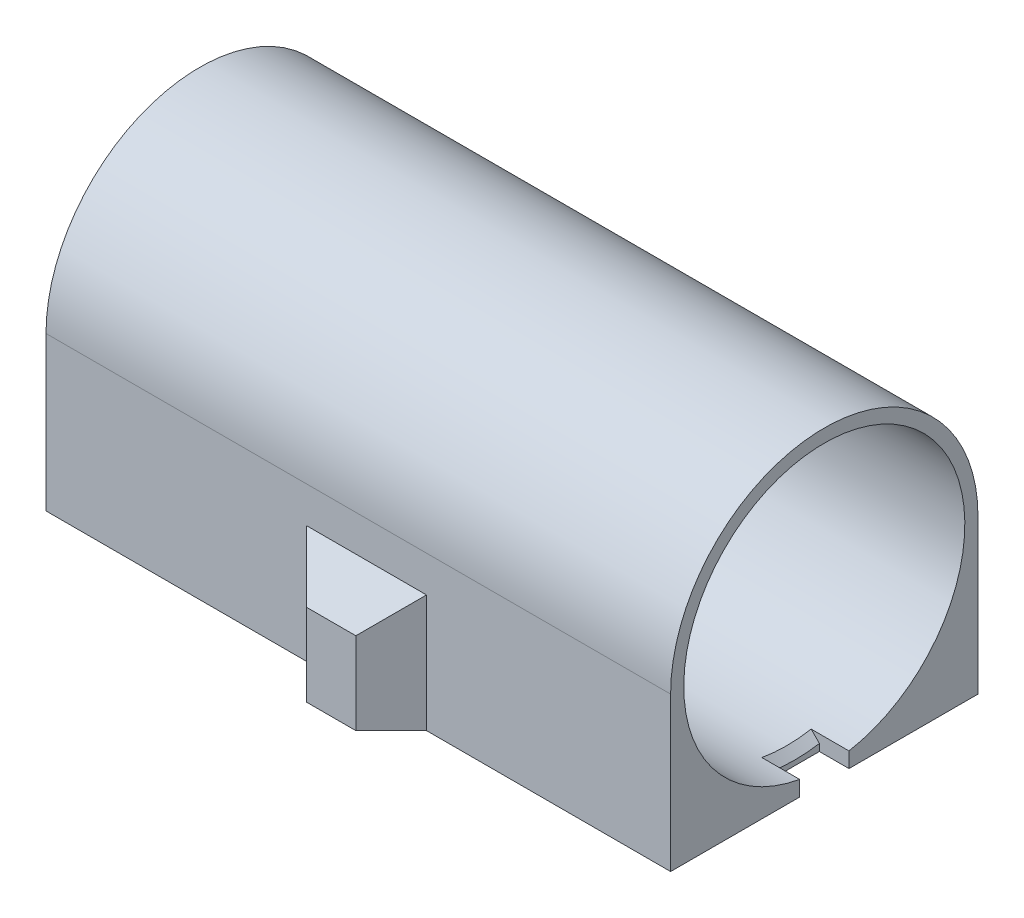
ISO-10303-21;
HEADER;
FILE_DESCRIPTION(('STEP AP214'),'2;1');
FILE_NAME('part.step','',(''),(''),'','','');
FILE_SCHEMA(('AUTOMOTIVE_DESIGN { 1 0 10303 214 1 1 1 1 }'));
ENDSEC;
DATA;
#1=APPLICATION_CONTEXT('core data for automotive mechanical design processes');
#2=APPLICATION_PROTOCOL_DEFINITION('international standard','automotive_design',2000,#1);
#3=PRODUCT_CONTEXT('',#1,'mechanical');
#4=PRODUCT('Part','Part','',(#3));
#5=PRODUCT_RELATED_PRODUCT_CATEGORY('part','',(#4));
#6=PRODUCT_DEFINITION_FORMATION('','',#4);
#7=PRODUCT_DEFINITION_CONTEXT('part definition',#1,'design');
#8=PRODUCT_DEFINITION('design','',#6,#7);
#9=PRODUCT_DEFINITION_SHAPE('','',#8);
#10=(LENGTH_UNIT() NAMED_UNIT(*) SI_UNIT(.MILLI.,.METRE.));
#11=(NAMED_UNIT(*) PLANE_ANGLE_UNIT() SI_UNIT($,.RADIAN.));
#12=(NAMED_UNIT(*) SI_UNIT($,.STERADIAN.) SOLID_ANGLE_UNIT());
#13=UNCERTAINTY_MEASURE_WITH_UNIT(LENGTH_MEASURE(1.E-05),#10,'distance_accuracy_value','');
#14=(GEOMETRIC_REPRESENTATION_CONTEXT(3) GLOBAL_UNCERTAINTY_ASSIGNED_CONTEXT((#13)) GLOBAL_UNIT_ASSIGNED_CONTEXT((#10,
#11,#12)) REPRESENTATION_CONTEXT('',''));
#15=CARTESIAN_POINT('',(0.,0.,0.));
#16=DIRECTION('',(0.,0.,1.));
#17=DIRECTION('',(1.,0.,0.));
#18=AXIS2_PLACEMENT_3D('',#15,#16,#17);
#19=CARTESIAN_POINT('',(-19.5,0.,-9.35));
#20=DIRECTION('',(0.,0.,-1.));
#21=DIRECTION('',(0.,1.,0.));
#22=AXIS2_PLACEMENT_3D('',#19,#20,#21);
#23=PLANE('',#22);
#24=DIRECTION('',(-1.,0.,0.));
#25=VECTOR('',#24,1.);
#26=CARTESIAN_POINT('',(-1.5,-2.20000000000001,-9.35000000000001));
#27=LINE('',#26,#25);
#28=CARTESIAN_POINT('',(-3.65000000000005,-2.19999999999999,-9.35));
#29=VERTEX_POINT('',#28);
#30=CARTESIAN_POINT('',(3.65000000000005,-2.19999999999999,-9.35));
#31=VERTEX_POINT('',#30);
#32=EDGE_CURVE('E51',#29,#31,#27,.F.);
#33=ORIENTED_EDGE('',*,*,#32,.F.);
#34=DIRECTION('',(0.,-1.,0.));
#35=VECTOR('',#34,1.);
#36=CARTESIAN_POINT('',(-3.65000000000005,-4.35,-9.35));
#37=LINE('',#36,#35);
#38=CARTESIAN_POINT('',(-3.65000000000005,-9.35,-9.35));
#39=VERTEX_POINT('',#38);
#40=EDGE_CURVE('E253',#29,#39,#37,.T.);
#41=ORIENTED_EDGE('',*,*,#40,.T.);
#42=DIRECTION('',(1.,0.,0.));
#43=VECTOR('',#42,1.);
#44=CARTESIAN_POINT('',(-19.5,-9.35,-9.35000000000006));
#45=LINE('',#44,#43);
#46=CARTESIAN_POINT('',(-19.5,-9.35,-9.35000000000006));
#47=VERTEX_POINT('',#46);
#48=EDGE_CURVE('E350',#47,#39,#45,.T.);
#49=ORIENTED_EDGE('',*,*,#48,.F.);
#50=DIRECTION('',(0.,1.,0.));
#51=VECTOR('',#50,1.);
#52=CARTESIAN_POINT('',(-19.5,0.,-9.35));
#53=LINE('',#52,#51);
#54=CARTESIAN_POINT('',(-19.5,0.,-9.35));
#55=VERTEX_POINT('',#54);
#56=EDGE_CURVE('E343',#47,#55,#53,.T.);
#57=ORIENTED_EDGE('',*,*,#56,.T.);
#58=DIRECTION('',(1.,0.,0.));
#59=VECTOR('',#58,1.);
#60=CARTESIAN_POINT('',(-19.5,0.,-9.35));
#61=LINE('',#60,#59);
#62=CARTESIAN_POINT('',(18.5,0.,-9.35));
#63=VERTEX_POINT('',#62);
#64=EDGE_CURVE('E347',#55,#63,#61,.T.);
#65=ORIENTED_EDGE('',*,*,#64,.T.);
#66=DIRECTION('',(0.,1.,0.));
#67=VECTOR('',#66,1.);
#68=CARTESIAN_POINT('',(18.5,0.,-9.35));
#69=LINE('',#68,#67);
#70=CARTESIAN_POINT('',(18.5,-9.35,-9.35000000000006));
#71=VERTEX_POINT('',#70);
#72=EDGE_CURVE('E333',#71,#63,#69,.T.);
#73=ORIENTED_EDGE('',*,*,#72,.F.);
#74=CARTESIAN_POINT('',(3.65000000000005,-9.35,-9.35000000000006));
#75=VERTEX_POINT('',#74);
#76=EDGE_CURVE('E230',#75,#71,#45,.T.);
#77=ORIENTED_EDGE('',*,*,#76,.F.);
#78=DIRECTION('',(0.,-1.,0.));
#79=VECTOR('',#78,1.);
#80=CARTESIAN_POINT('',(3.65000000000005,-4.35,-9.35));
#81=LINE('',#80,#79);
#82=EDGE_CURVE('E511',#31,#75,#81,.T.);
#83=ORIENTED_EDGE('',*,*,#82,.F.);
#84=EDGE_LOOP('',(#33,#41,#49,#57,#65,#73,#77,#83));
#85=FACE_BOUND('',#84,.T.);
#86=ADVANCED_FACE('F47',(#85),#23,.T.);
#87=CARTESIAN_POINT('',(-19.5,0.,0.));
#88=DIRECTION('',(1.,0.,0.));
#89=DIRECTION('',(0.,0.,-1.));
#90=AXIS2_PLACEMENT_3D('',#87,#88,#89);
#91=CYLINDRICAL_SURFACE('',#90,8.55);
#92=DIRECTION('',(1.,0.,0.));
#93=VECTOR('',#92,1.);
#94=CARTESIAN_POINT('',(-19.5,-8.41739270795892,-1.5));
#95=LINE('',#94,#93);
#96=CARTESIAN_POINT('',(-16.2,-8.41739270795892,-1.5));
#97=VERTEX_POINT('',#96);
#98=CARTESIAN_POINT('',(-17.8673927079589,-8.41739270795892,-1.5));
#99=VERTEX_POINT('',#98);
#100=EDGE_CURVE('E215',#97,#99,#95,.F.);
#101=ORIENTED_EDGE('',*,*,#100,.F.);
#102=CARTESIAN_POINT('',(-16.2,0.,0.));
#103=DIRECTION('',(1.,0.,0.));
#104=DIRECTION('',(0.,0.,-1.));
#105=AXIS2_PLACEMENT_3D('',#102,#103,#104);
#106=CIRCLE('',#105,8.55);
#107=CARTESIAN_POINT('',(-16.2,-8.41739270795892,1.5));
#108=VERTEX_POINT('',#107);
#109=EDGE_CURVE('E359',#97,#108,#106,.F.);
#110=ORIENTED_EDGE('',*,*,#109,.T.);
#111=DIRECTION('',(1.,0.,0.));
#112=VECTOR('',#111,1.);
#113=CARTESIAN_POINT('',(-19.5,-8.41739270795892,1.5));
#114=LINE('',#113,#112);
#115=CARTESIAN_POINT('',(-17.8673927079589,-8.41739270795892,1.5));
#116=VERTEX_POINT('',#115);
#117=EDGE_CURVE('E311',#116,#108,#114,.T.);
#118=ORIENTED_EDGE('',*,*,#117,.F.);
#119=CARTESIAN_POINT('',(-9.45,0.,0.));
#120=DIRECTION('',(-0.707106781186547,0.707106781186547,0.));
#121=DIRECTION('',(0.707106781186548,0.707106781186548,0.));
#122=AXIS2_PLACEMENT_3D('',#119,#120,#121);
#123=ELLIPSE('',#122,12.09152595829,8.55);
#124=CARTESIAN_POINT('',(-17.5,-8.05,2.88097205817757));
#125=VERTEX_POINT('',#124);
#126=EDGE_CURVE('E546',#116,#125,#123,.T.);
#127=ORIENTED_EDGE('',*,*,#126,.T.);
#128=CARTESIAN_POINT('',(-17.5,0.,0.));
#129=DIRECTION('',(-1.,0.,0.));
#130=DIRECTION('',(0.,0.,1.));
#131=AXIS2_PLACEMENT_3D('',#128,#129,#130);
#132=CIRCLE('',#131,8.55);
#133=CARTESIAN_POINT('',(-17.5,-8.05,-2.88097205817757));
#134=VERTEX_POINT('',#133);
#135=EDGE_CURVE('E349',#134,#125,#132,.F.);
#136=ORIENTED_EDGE('',*,*,#135,.F.);
#137=CARTESIAN_POINT('',(-9.45,0.,0.));
#138=DIRECTION('',(-0.707106781186547,0.707106781186547,0.));
#139=DIRECTION('',(0.707106781186548,0.707106781186548,0.));
#140=AXIS2_PLACEMENT_3D('',#137,#138,#139);
#141=ELLIPSE('',#140,12.09152595829,8.55);
#142=EDGE_CURVE('E544',#134,#99,#141,.T.);
#143=ORIENTED_EDGE('',*,*,#142,.T.);
#144=EDGE_LOOP('',(#101,#110,#118,#127,#136,#143));
#145=FACE_BOUND('',#144,.T.);
#146=CARTESIAN_POINT('',(18.5,0.,0.));
#147=DIRECTION('',(1.,0.,0.));
#148=DIRECTION('',(0.,0.,-1.));
#149=AXIS2_PLACEMENT_3D('',#146,#147,#148);
#150=CIRCLE('',#149,8.55);
#151=CARTESIAN_POINT('',(18.5,-8.41739270795892,-1.5));
#152=VERTEX_POINT('',#151);
#153=CARTESIAN_POINT('',(18.5,-8.41739270795892,1.5));
#154=VERTEX_POINT('',#153);
#155=EDGE_CURVE('E318',#152,#154,#150,.T.);
#156=ORIENTED_EDGE('',*,*,#155,.T.);
#157=DIRECTION('',(1.,0.,0.));
#158=VECTOR('',#157,1.);
#159=CARTESIAN_POINT('',(-19.5,-8.41739270795892,1.50000000000001));
#160=LINE('',#159,#158);
#161=CARTESIAN_POINT('',(16.2,-8.41739270795892,1.50000000000001));
#162=VERTEX_POINT('',#161);
#163=EDGE_CURVE('E282',#154,#162,#160,.F.);
#164=ORIENTED_EDGE('',*,*,#163,.T.);
#165=CARTESIAN_POINT('',(16.2,0.,0.));
#166=DIRECTION('',(1.,0.,0.));
#167=DIRECTION('',(0.,0.,-1.));
#168=AXIS2_PLACEMENT_3D('',#165,#166,#167);
#169=CIRCLE('',#168,8.55);
#170=CARTESIAN_POINT('',(16.2,-8.41739270795892,-1.50000000000001));
#171=VERTEX_POINT('',#170);
#172=EDGE_CURVE('E928',#162,#171,#169,.T.);
#173=ORIENTED_EDGE('',*,*,#172,.T.);
#174=DIRECTION('',(1.,0.,0.));
#175=VECTOR('',#174,1.);
#176=CARTESIAN_POINT('',(-19.5,-8.41739270795892,-1.50000000000001));
#177=LINE('',#176,#175);
#178=EDGE_CURVE('E268',#171,#152,#177,.T.);
#179=ORIENTED_EDGE('',*,*,#178,.T.);
#180=EDGE_LOOP('',(#156,#164,#173,#179));
#181=FACE_BOUND('',#180,.T.);
#182=ADVANCED_FACE('F453',(#145,#181),#91,.F.);
#183=CARTESIAN_POINT('',(-19.5,-9.35,9.35));
#184=DIRECTION('',(0.,-1.,0.));
#185=DIRECTION('',(0.,0.,-1.));
#186=AXIS2_PLACEMENT_3D('',#183,#184,#185);
#187=PLANE('',#186);
#188=CARTESIAN_POINT('',(0.,-9.35,-8.5));
#189=DIRECTION('',(0.,-1.,0.));
#190=DIRECTION('',(0.,0.,-1.));
#191=AXIS2_PLACEMENT_3D('',#188,#189,#190);
#192=CIRCLE('',#191,2.00000000000001);
#193=CARTESIAN_POINT('',(0.,-9.35,-10.5));
#194=VERTEX_POINT('',#193);
#195=EDGE_CURVE('E57',#194,#194,#192,.F.);
#196=ORIENTED_EDGE('',*,*,#195,.T.);
#197=EDGE_LOOP('',(#196));
#198=FACE_BOUND('',#197,.T.);
#199=CARTESIAN_POINT('',(0.,-9.35,8.5));
#200=DIRECTION('',(0.,-1.,0.));
#201=DIRECTION('',(0.,0.,-1.));
#202=AXIS2_PLACEMENT_3D('',#199,#200,#201);
#203=CIRCLE('',#202,2.00000000000001);
#204=CARTESIAN_POINT('',(0.,-9.35,6.49999999999999));
#205=VERTEX_POINT('',#204);
#206=EDGE_CURVE('E536',#205,#205,#203,.F.);
#207=ORIENTED_EDGE('',*,*,#206,.T.);
#208=EDGE_LOOP('',(#207));
#209=FACE_BOUND('',#208,.T.);
#210=DIRECTION('',(1.,0.,0.));
#211=VECTOR('',#210,1.);
#212=CARTESIAN_POINT('',(16.7,-9.35,1.5));
#213=LINE('',#212,#211);
#214=CARTESIAN_POINT('',(16.7,-9.35,1.5));
#215=VERTEX_POINT('',#214);
#216=CARTESIAN_POINT('',(18.5,-9.35,1.5));
#217=VERTEX_POINT('',#216);
#218=EDGE_CURVE('E271',#215,#217,#213,.T.);
#219=ORIENTED_EDGE('',*,*,#218,.T.);
#220=DIRECTION('',(0.,0.,-1.));
#221=VECTOR('',#220,1.);
#222=CARTESIAN_POINT('',(18.5,-9.35,9.35));
#223=LINE('',#222,#221);
#224=CARTESIAN_POINT('',(18.5,-9.35,9.35));
#225=VERTEX_POINT('',#224);
#226=EDGE_CURVE('E330',#225,#217,#223,.T.);
#227=ORIENTED_EDGE('',*,*,#226,.F.);
#228=DIRECTION('',(1.,0.,0.));
#229=VECTOR('',#228,1.);
#230=CARTESIAN_POINT('',(-19.5,-9.35,9.35));
#231=LINE('',#230,#229);
#232=CARTESIAN_POINT('',(3.65000000000005,-9.35,9.35));
#233=VERTEX_POINT('',#232);
#234=EDGE_CURVE('E231',#233,#225,#231,.T.);
#235=ORIENTED_EDGE('',*,*,#234,.F.);
#236=DIRECTION('',(-0.707106781186556,0.,0.707106781186539));
#237=VECTOR('',#236,1.);
#238=CARTESIAN_POINT('',(1.5,-9.35,11.5));
#239=LINE('',#238,#237);
#240=CARTESIAN_POINT('',(1.5,-9.35,11.5));
#241=VERTEX_POINT('',#240);
#242=EDGE_CURVE('E248',#233,#241,#239,.T.);
#243=ORIENTED_EDGE('',*,*,#242,.T.);
#244=DIRECTION('',(-1.,0.,0.));
#245=VECTOR('',#244,1.);
#246=CARTESIAN_POINT('',(-1.5,-9.35,11.5));
#247=LINE('',#246,#245);
#248=CARTESIAN_POINT('',(-1.5,-9.35,11.5));
#249=VERTEX_POINT('',#248);
#250=EDGE_CURVE('E247',#241,#249,#247,.T.);
#251=ORIENTED_EDGE('',*,*,#250,.T.);
#252=DIRECTION('',(-0.707106781186556,0.,-0.707106781186539));
#253=VECTOR('',#252,1.);
#254=CARTESIAN_POINT('',(-1.5,-9.35,11.5));
#255=LINE('',#254,#253);
#256=CARTESIAN_POINT('',(-3.65000000000005,-9.35,9.35));
#257=VERTEX_POINT('',#256);
#258=EDGE_CURVE('E237',#249,#257,#255,.T.);
#259=ORIENTED_EDGE('',*,*,#258,.T.);
#260=CARTESIAN_POINT('',(-19.5,-9.35,9.35));
#261=VERTEX_POINT('',#260);
#262=EDGE_CURVE('E220',#261,#257,#231,.T.);
#263=ORIENTED_EDGE('',*,*,#262,.F.);
#264=DIRECTION('',(0.,0.,-1.));
#265=VECTOR('',#264,1.);
#266=CARTESIAN_POINT('',(-19.5,-9.35,9.35));
#267=LINE('',#266,#265);
#268=CARTESIAN_POINT('',(-19.5,-9.35,1.5));
#269=VERTEX_POINT('',#268);
#270=EDGE_CURVE('E341',#261,#269,#267,.T.);
#271=ORIENTED_EDGE('',*,*,#270,.T.);
#272=DIRECTION('',(-1.,0.,0.));
#273=VECTOR('',#272,1.);
#274=CARTESIAN_POINT('',(-16.7,-9.35,1.5));
#275=LINE('',#274,#273);
#276=CARTESIAN_POINT('',(-16.7,-9.35,1.5));
#277=VERTEX_POINT('',#276);
#278=EDGE_CURVE('E303',#277,#269,#275,.T.);
#279=ORIENTED_EDGE('',*,*,#278,.F.);
#280=DIRECTION('',(0.,0.,1.));
#281=VECTOR('',#280,1.);
#282=CARTESIAN_POINT('',(-16.7,-9.35,-1.5));
#283=LINE('',#282,#281);
#284=CARTESIAN_POINT('',(-16.7,-9.35,-1.5));
#285=VERTEX_POINT('',#284);
#286=EDGE_CURVE('E305',#285,#277,#283,.T.);
#287=ORIENTED_EDGE('',*,*,#286,.F.);
#288=DIRECTION('',(1.,0.,0.));
#289=VECTOR('',#288,1.);
#290=CARTESIAN_POINT('',(-17.5,-9.35,-1.5));
#291=LINE('',#290,#289);
#292=CARTESIAN_POINT('',(-19.5,-9.35,-1.5));
#293=VERTEX_POINT('',#292);
#294=EDGE_CURVE('E300',#293,#285,#291,.T.);
#295=ORIENTED_EDGE('',*,*,#294,.F.);
#296=EDGE_CURVE('E340',#293,#47,#267,.T.);
#297=ORIENTED_EDGE('',*,*,#296,.T.);
#298=ORIENTED_EDGE('',*,*,#48,.T.);
#299=DIRECTION('',(-0.707106781186556,0.,0.707106781186539));
#300=VECTOR('',#299,1.);
#301=CARTESIAN_POINT('',(-1.5,-9.35,-11.5));
#302=LINE('',#301,#300);
#303=CARTESIAN_POINT('',(-1.5,-9.35,-11.5));
#304=VERTEX_POINT('',#303);
#305=EDGE_CURVE('E914',#304,#39,#302,.T.);
#306=ORIENTED_EDGE('',*,*,#305,.F.);
#307=DIRECTION('',(-1.,0.,0.));
#308=VECTOR('',#307,1.);
#309=CARTESIAN_POINT('',(-1.5,-9.35,-11.5));
#310=LINE('',#309,#308);
#311=CARTESIAN_POINT('',(1.5,-9.35,-11.5));
#312=VERTEX_POINT('',#311);
#313=EDGE_CURVE('E916',#312,#304,#310,.T.);
#314=ORIENTED_EDGE('',*,*,#313,.F.);
#315=DIRECTION('',(-0.707106781186556,0.,-0.707106781186539));
#316=VECTOR('',#315,1.);
#317=CARTESIAN_POINT('',(1.5,-9.35,-11.5));
#318=LINE('',#317,#316);
#319=EDGE_CURVE('E66',#75,#312,#318,.T.);
#320=ORIENTED_EDGE('',*,*,#319,.F.);
#321=ORIENTED_EDGE('',*,*,#76,.T.);
#322=CARTESIAN_POINT('',(18.5,-9.35,-1.5));
#323=VERTEX_POINT('',#322);
#324=EDGE_CURVE('E329',#323,#71,#223,.T.);
#325=ORIENTED_EDGE('',*,*,#324,.F.);
#326=DIRECTION('',(-1.,0.,0.));
#327=VECTOR('',#326,1.);
#328=CARTESIAN_POINT('',(17.5,-9.35,-1.5));
#329=LINE('',#328,#327);
#330=CARTESIAN_POINT('',(16.7,-9.35,-1.5));
#331=VERTEX_POINT('',#330);
#332=EDGE_CURVE('E275',#323,#331,#329,.T.);
#333=ORIENTED_EDGE('',*,*,#332,.T.);
#334=DIRECTION('',(0.,0.,1.));
#335=VECTOR('',#334,1.);
#336=CARTESIAN_POINT('',(16.7,-9.35,-1.5));
#337=LINE('',#336,#335);
#338=EDGE_CURVE('E279',#331,#215,#337,.T.);
#339=ORIENTED_EDGE('',*,*,#338,.T.);
#340=EDGE_LOOP('',(#219,#227,#235,#243,#251,#259,#263,#271,#279,#287,#295,#297,#298,#306,#314,
#320,#321,#325,#333,#339));
#341=FACE_BOUND('',#340,.T.);
#342=ADVANCED_FACE('F244',(#198,#209,#341),#187,.T.);
#343=CARTESIAN_POINT('',(-19.5,0.,0.));
#344=DIRECTION('',(1.,0.,0.));
#345=DIRECTION('',(0.,0.,-1.));
#346=AXIS2_PLACEMENT_3D('',#343,#344,#345);
#347=CYLINDRICAL_SURFACE('',#346,9.35);
#348=DIRECTION('',(1.,0.,0.));
#349=VECTOR('',#348,1.);
#350=CARTESIAN_POINT('',(-19.5,0.,9.35));
#351=LINE('',#350,#349);
#352=CARTESIAN_POINT('',(-19.5,0.,9.35));
#353=VERTEX_POINT('',#352);
#354=CARTESIAN_POINT('',(18.5,0.,9.35));
#355=VERTEX_POINT('',#354);
#356=EDGE_CURVE('E346',#353,#355,#351,.T.);
#357=ORIENTED_EDGE('',*,*,#356,.T.);
#358=CARTESIAN_POINT('',(18.5,0.,0.));
#359=DIRECTION('',(1.,0.,0.));
#360=DIRECTION('',(0.,0.,-1.));
#361=AXIS2_PLACEMENT_3D('',#358,#359,#360);
#362=CIRCLE('',#361,9.35);
#363=EDGE_CURVE('E323',#63,#355,#362,.T.);
#364=ORIENTED_EDGE('',*,*,#363,.F.);
#365=ORIENTED_EDGE('',*,*,#64,.F.);
#366=CARTESIAN_POINT('',(-19.5,0.,0.));
#367=DIRECTION('',(1.,0.,0.));
#368=DIRECTION('',(0.,0.,-1.));
#369=AXIS2_PLACEMENT_3D('',#366,#367,#368);
#370=CIRCLE('',#369,9.35);
#371=EDGE_CURVE('E336',#55,#353,#370,.T.);
#372=ORIENTED_EDGE('',*,*,#371,.T.);
#373=EDGE_LOOP('',(#357,#364,#365,#372));
#374=FACE_BOUND('',#373,.T.);
#375=ADVANCED_FACE('F392',(#374),#347,.T.);
#376=CARTESIAN_POINT('',(-19.5,0.,9.35));
#377=DIRECTION('',(0.,0.,1.));
#378=DIRECTION('',(1.,0.,0.));
#379=AXIS2_PLACEMENT_3D('',#376,#377,#378);
#380=PLANE('',#379);
#381=DIRECTION('',(0.,-1.,0.));
#382=VECTOR('',#381,1.);
#383=CARTESIAN_POINT('',(-3.65000000000005,-4.35,9.35));
#384=LINE('',#383,#382);
#385=CARTESIAN_POINT('',(-3.65000000000005,-2.19999999999999,9.35));
#386=VERTEX_POINT('',#385);
#387=EDGE_CURVE('E223',#386,#257,#384,.T.);
#388=ORIENTED_EDGE('',*,*,#387,.F.);
#389=DIRECTION('',(-1.,0.,0.));
#390=VECTOR('',#389,1.);
#391=CARTESIAN_POINT('',(-19.5,-2.19999999999999,9.35));
#392=LINE('',#391,#390);
#393=CARTESIAN_POINT('',(3.65000000000005,-2.19999999999999,9.35));
#394=VERTEX_POINT('',#393);
#395=EDGE_CURVE('E531',#386,#394,#392,.F.);
#396=ORIENTED_EDGE('',*,*,#395,.T.);
#397=DIRECTION('',(0.,-1.,0.));
#398=VECTOR('',#397,1.);
#399=CARTESIAN_POINT('',(3.65000000000005,-4.35,9.35));
#400=LINE('',#399,#398);
#401=EDGE_CURVE('E241',#394,#233,#400,.T.);
#402=ORIENTED_EDGE('',*,*,#401,.T.);
#403=ORIENTED_EDGE('',*,*,#234,.T.);
#404=DIRECTION('',(0.,-1.,0.));
#405=VECTOR('',#404,1.);
#406=CARTESIAN_POINT('',(18.5,0.,9.35));
#407=LINE('',#406,#405);
#408=EDGE_CURVE('E326',#355,#225,#407,.T.);
#409=ORIENTED_EDGE('',*,*,#408,.F.);
#410=ORIENTED_EDGE('',*,*,#356,.F.);
#411=DIRECTION('',(0.,-1.,0.));
#412=VECTOR('',#411,1.);
#413=CARTESIAN_POINT('',(-19.5,0.,9.35));
#414=LINE('',#413,#412);
#415=EDGE_CURVE('E226',#353,#261,#414,.T.);
#416=ORIENTED_EDGE('',*,*,#415,.T.);
#417=ORIENTED_EDGE('',*,*,#262,.T.);
#418=EDGE_LOOP('',(#388,#396,#402,#403,#409,#410,#416,#417));
#419=FACE_BOUND('',#418,.T.);
#420=ADVANCED_FACE('F222',(#419),#380,.T.);
#421=CARTESIAN_POINT('',(-19.5,0.,0.));
#422=DIRECTION('',(1.,0.,0.));
#423=DIRECTION('',(0.,0.,-1.));
#424=AXIS2_PLACEMENT_3D('',#421,#422,#423);
#425=PLANE('',#424);
#426=DIRECTION('',(0.,0.,-1.));
#427=VECTOR('',#426,1.);
#428=CARTESIAN_POINT('',(-19.5,-9.05,1.5));
#429=LINE('',#428,#427);
#430=CARTESIAN_POINT('',(-19.5,-9.05,1.5));
#431=VERTEX_POINT('',#430);
#432=CARTESIAN_POINT('',(-19.5,-9.05,-1.5));
#433=VERTEX_POINT('',#432);
#434=EDGE_CURVE('E273',#431,#433,#429,.T.);
#435=ORIENTED_EDGE('',*,*,#434,.F.);
#436=DIRECTION('',(0.,1.,0.));
#437=VECTOR('',#436,1.);
#438=CARTESIAN_POINT('',(-19.5,-9.35,1.5));
#439=LINE('',#438,#437);
#440=EDGE_CURVE('E292',#269,#431,#439,.T.);
#441=ORIENTED_EDGE('',*,*,#440,.F.);
#442=ORIENTED_EDGE('',*,*,#270,.F.);
#443=ORIENTED_EDGE('',*,*,#415,.F.);
#444=ORIENTED_EDGE('',*,*,#371,.F.);
#445=ORIENTED_EDGE('',*,*,#56,.F.);
#446=ORIENTED_EDGE('',*,*,#296,.F.);
#447=DIRECTION('',(0.,-1.,0.));
#448=VECTOR('',#447,1.);
#449=CARTESIAN_POINT('',(-19.5,-9.05,-1.5));
#450=LINE('',#449,#448);
#451=EDGE_CURVE('E289',#433,#293,#450,.T.);
#452=ORIENTED_EDGE('',*,*,#451,.F.);
#453=EDGE_LOOP('',(#435,#441,#442,#443,#444,#445,#446,#452));
#454=FACE_BOUND('',#453,.T.);
#455=CARTESIAN_POINT('',(-19.5,0.,0.));
#456=DIRECTION('',(-1.,0.,0.));
#457=DIRECTION('',(0.,0.,1.));
#458=AXIS2_PLACEMENT_3D('',#455,#456,#457);
#459=CIRCLE('',#458,3.);
#460=CARTESIAN_POINT('',(-19.5,0.,3.));
#461=VERTEX_POINT('',#460);
#462=EDGE_CURVE('E314',#461,#461,#459,.T.);
#463=ORIENTED_EDGE('',*,*,#462,.F.);
#464=EDGE_LOOP('',(#463));
#465=FACE_BOUND('',#464,.T.);
#466=ADVANCED_FACE('F465',(#454,#465),#425,.F.);
#467=CARTESIAN_POINT('',(18.5,0.,0.));
#468=DIRECTION('',(1.,0.,0.));
#469=DIRECTION('',(0.,0.,-1.));
#470=AXIS2_PLACEMENT_3D('',#467,#468,#469);
#471=PLANE('',#470);
#472=DIRECTION('',(0.,-1.,0.));
#473=VECTOR('',#472,1.);
#474=CARTESIAN_POINT('',(18.5,-8.41739270795892,1.5));
#475=LINE('',#474,#473);
#476=EDGE_CURVE('E260',#154,#217,#475,.T.);
#477=ORIENTED_EDGE('',*,*,#476,.F.);
#478=ORIENTED_EDGE('',*,*,#155,.F.);
#479=DIRECTION('',(0.,1.,0.));
#480=VECTOR('',#479,1.);
#481=CARTESIAN_POINT('',(18.5,-9.35,-1.5));
#482=LINE('',#481,#480);
#483=EDGE_CURVE('E265',#323,#152,#482,.T.);
#484=ORIENTED_EDGE('',*,*,#483,.F.);
#485=ORIENTED_EDGE('',*,*,#324,.T.);
#486=ORIENTED_EDGE('',*,*,#72,.T.);
#487=ORIENTED_EDGE('',*,*,#363,.T.);
#488=ORIENTED_EDGE('',*,*,#408,.T.);
#489=ORIENTED_EDGE('',*,*,#226,.T.);
#490=EDGE_LOOP('',(#477,#478,#484,#485,#486,#487,#488,#489));
#491=FACE_BOUND('',#490,.T.);
#492=ADVANCED_FACE('F474',(#491),#471,.T.);
#493=CARTESIAN_POINT('',(-17.5,0.,0.));
#494=DIRECTION('',(-1.,0.,0.));
#495=DIRECTION('',(0.,0.,1.));
#496=AXIS2_PLACEMENT_3D('',#493,#494,#495);
#497=PLANE('',#496);
#498=CARTESIAN_POINT('',(-17.5,0.,0.));
#499=DIRECTION('',(-1.,0.,0.));
#500=DIRECTION('',(0.,0.,1.));
#501=AXIS2_PLACEMENT_3D('',#498,#499,#500);
#502=CIRCLE('',#501,3.);
#503=CARTESIAN_POINT('',(-17.5,0.,3.));
#504=VERTEX_POINT('',#503);
#505=EDGE_CURVE('E315',#504,#504,#502,.T.);
#506=ORIENTED_EDGE('',*,*,#505,.T.);
#507=EDGE_LOOP('',(#506));
#508=FACE_BOUND('',#507,.T.);
#509=ORIENTED_EDGE('',*,*,#135,.T.);
#510=DIRECTION('',(0.,0.,-1.));
#511=VECTOR('',#510,1.);
#512=CARTESIAN_POINT('',(-17.5,-8.05,0.));
#513=LINE('',#512,#511);
#514=EDGE_CURVE('E550',#125,#134,#513,.T.);
#515=ORIENTED_EDGE('',*,*,#514,.T.);
#516=EDGE_LOOP('',(#509,#515));
#517=FACE_BOUND('',#516,.T.);
#518=ADVANCED_FACE('F449',(#508,#517),#497,.F.);
#519=CARTESIAN_POINT('',(-17.5,0.,0.));
#520=DIRECTION('',(-1.,0.,0.));
#521=DIRECTION('',(0.,0.,1.));
#522=AXIS2_PLACEMENT_3D('',#519,#520,#521);
#523=CYLINDRICAL_SURFACE('',#522,3.);
#524=ORIENTED_EDGE('',*,*,#505,.F.);
#525=EDGE_LOOP('',(#524));
#526=FACE_BOUND('',#525,.T.);
#527=ORIENTED_EDGE('',*,*,#462,.T.);
#528=EDGE_LOOP('',(#527));
#529=FACE_BOUND('',#528,.T.);
#530=ADVANCED_FACE('F442',(#526,#529),#523,.F.);
#531=CARTESIAN_POINT('',(-16.7,9.351,1.5));
#532=DIRECTION('',(0.,0.,1.));
#533=DIRECTION('',(1.,0.,0.));
#534=AXIS2_PLACEMENT_3D('',#531,#532,#533);
#535=PLANE('',#534);
#536=ORIENTED_EDGE('',*,*,#117,.T.);
#537=CARTESIAN_POINT('',(-16.2,-8.41739270795892,1.5));
#538=CARTESIAN_POINT('',(-16.2832973583994,-8.50200019290809,1.5));
#539=CARTESIAN_POINT('',(-16.3666127043193,-8.586589953795,1.5));
#540=CARTESIAN_POINT('',(-16.5332793709861,-8.7557340272269,1.5));
#541=CARTESIAN_POINT('',(-16.6166306917328,-8.84028833977199,1.5));
#542=CARTESIAN_POINT('',(-16.7,-8.9248249282549,1.5));
#543=B_SPLINE_CURVE_WITH_KNOTS('',3,(#537,#538,#539,#540,#541,#542),.UNSPECIFIED.,.F.,.F.,(4,2,
4),(0.,0.356190778395463,0.712381555875412),.UNSPECIFIED.);
#544=CARTESIAN_POINT('',(-16.7,-8.9248249282549,1.5));
#545=VERTEX_POINT('',#544);
#546=EDGE_CURVE('E370',#108,#545,#543,.T.);
#547=ORIENTED_EDGE('',*,*,#546,.T.);
#548=DIRECTION('',(0.,-1.,0.));
#549=VECTOR('',#548,1.);
#550=CARTESIAN_POINT('',(-16.7,9.351,1.5));
#551=LINE('',#550,#549);
#552=EDGE_CURVE('E298',#545,#277,#551,.T.);
#553=ORIENTED_EDGE('',*,*,#552,.T.);
#554=ORIENTED_EDGE('',*,*,#278,.T.);
#555=ORIENTED_EDGE('',*,*,#440,.T.);
#556=DIRECTION('',(-1.,0.,0.));
#557=VECTOR('',#556,1.);
#558=CARTESIAN_POINT('',(-14.4850373136637,-9.05,1.5));
#559=LINE('',#558,#557);
#560=CARTESIAN_POINT('',(-18.5,-9.05,1.5));
#561=VERTEX_POINT('',#560);
#562=EDGE_CURVE('E296',#561,#431,#559,.T.);
#563=ORIENTED_EDGE('',*,*,#562,.F.);
#564=DIRECTION('',(-0.707106781186548,-0.707106781186548,0.));
#565=VECTOR('',#564,1.);
#566=CARTESIAN_POINT('',(-8.3995,1.0505,1.5));
#567=LINE('',#566,#565);
#568=EDGE_CURVE('E548',#561,#116,#567,.F.);
#569=ORIENTED_EDGE('',*,*,#568,.T.);
#570=EDGE_LOOP('',(#536,#547,#553,#554,#555,#563,#569));
#571=FACE_BOUND('',#570,.T.);
#572=ADVANCED_FACE('F438',(#571),#535,.F.);
#573=CARTESIAN_POINT('',(-16.7,9.351,-1.5));
#574=DIRECTION('',(1.,0.,0.));
#575=DIRECTION('',(0.,0.,-1.));
#576=AXIS2_PLACEMENT_3D('',#573,#574,#575);
#577=PLANE('',#576);
#578=ORIENTED_EDGE('',*,*,#552,.F.);
#579=CARTESIAN_POINT('',(-16.7,0.,0.));
#580=DIRECTION('',(1.,0.,0.));
#581=DIRECTION('',(0.,0.,-1.));
#582=AXIS2_PLACEMENT_3D('',#579,#580,#581);
#583=CIRCLE('',#582,9.05);
#584=CARTESIAN_POINT('',(-16.7,-8.9248249282549,-1.5));
#585=VERTEX_POINT('',#584);
#586=EDGE_CURVE('E356',#545,#585,#583,.T.);
#587=ORIENTED_EDGE('',*,*,#586,.T.);
#588=DIRECTION('',(0.,-1.,0.));
#589=VECTOR('',#588,1.);
#590=CARTESIAN_POINT('',(-16.7,9.351,-1.5));
#591=LINE('',#590,#589);
#592=EDGE_CURVE('E308',#585,#285,#591,.T.);
#593=ORIENTED_EDGE('',*,*,#592,.T.);
#594=ORIENTED_EDGE('',*,*,#286,.T.);
#595=EDGE_LOOP('',(#578,#587,#593,#594));
#596=FACE_BOUND('',#595,.T.);
#597=ADVANCED_FACE('F441',(#596),#577,.F.);
#598=CARTESIAN_POINT('',(-17.5,9.351,-1.5));
#599=DIRECTION('',(0.,0.,-1.));
#600=DIRECTION('',(-1.,0.,0.));
#601=AXIS2_PLACEMENT_3D('',#598,#599,#600);
#602=PLANE('',#601);
#603=ORIENTED_EDGE('',*,*,#100,.T.);
#604=DIRECTION('',(0.707106781186548,0.707106781186548,0.));
#605=VECTOR('',#604,1.);
#606=CARTESIAN_POINT('',(-8.7995,0.6505,-1.5));
#607=LINE('',#606,#605);
#608=CARTESIAN_POINT('',(-18.5,-9.05,-1.5));
#609=VERTEX_POINT('',#608);
#610=EDGE_CURVE('E542',#99,#609,#607,.F.);
#611=ORIENTED_EDGE('',*,*,#610,.T.);
#612=DIRECTION('',(-1.,0.,0.));
#613=VECTOR('',#612,1.);
#614=CARTESIAN_POINT('',(-14.4850373136637,-9.05,-1.5));
#615=LINE('',#614,#613);
#616=EDGE_CURVE('E295',#609,#433,#615,.T.);
#617=ORIENTED_EDGE('',*,*,#616,.T.);
#618=ORIENTED_EDGE('',*,*,#451,.T.);
#619=ORIENTED_EDGE('',*,*,#294,.T.);
#620=ORIENTED_EDGE('',*,*,#592,.F.);
#621=CARTESIAN_POINT('',(-16.7,-8.9248249282549,-1.5));
#622=CARTESIAN_POINT('',(-16.6166306917328,-8.84028833977199,-1.5));
#623=CARTESIAN_POINT('',(-16.5332793709861,-8.7557340272269,-1.5));
#624=CARTESIAN_POINT('',(-16.3666127043193,-8.586589953795,-1.5));
#625=CARTESIAN_POINT('',(-16.2832973583994,-8.50200019290809,-1.5));
#626=CARTESIAN_POINT('',(-16.2,-8.41739270795892,-1.5));
#627=B_SPLINE_CURVE_WITH_KNOTS('',3,(#621,#622,#623,#624,#625,#626),.UNSPECIFIED.,.F.,.F.,(4,2,
4),(0.,0.356190777479949,0.712381555875412),.UNSPECIFIED.);
#628=EDGE_CURVE('E362',#585,#97,#627,.T.);
#629=ORIENTED_EDGE('',*,*,#628,.T.);
#630=EDGE_LOOP('',(#603,#611,#617,#618,#619,#620,#629));
#631=FACE_BOUND('',#630,.T.);
#632=ADVANCED_FACE('F377',(#631),#602,.F.);
#633=CARTESIAN_POINT('',(-14.4850373136637,-9.05,1.5));
#634=DIRECTION('',(0.,1.,0.));
#635=DIRECTION('',(0.,0.,1.));
#636=AXIS2_PLACEMENT_3D('',#633,#634,#635);
#637=PLANE('',#636);
#638=ORIENTED_EDGE('',*,*,#616,.F.);
#639=DIRECTION('',(0.,0.,1.));
#640=VECTOR('',#639,1.);
#641=CARTESIAN_POINT('',(-18.5,-9.05,1.5));
#642=LINE('',#641,#640);
#643=EDGE_CURVE('E424',#609,#561,#642,.T.);
#644=ORIENTED_EDGE('',*,*,#643,.T.);
#645=ORIENTED_EDGE('',*,*,#562,.T.);
#646=ORIENTED_EDGE('',*,*,#434,.T.);
#647=EDGE_LOOP('',(#638,#644,#645,#646));
#648=FACE_BOUND('',#647,.T.);
#649=ADVANCED_FACE('F390',(#648),#637,.F.);
#650=CARTESIAN_POINT('',(-16.7,0.,0.));
#651=DIRECTION('',(-1.,0.,0.));
#652=DIRECTION('',(0.,0.,1.));
#653=AXIS2_PLACEMENT_3D('',#650,#651,#652);
#654=CONICAL_SURFACE('',#653,9.05,0.785398163397445);
#655=ORIENTED_EDGE('',*,*,#546,.F.);
#656=ORIENTED_EDGE('',*,*,#109,.F.);
#657=ORIENTED_EDGE('',*,*,#628,.F.);
#658=ORIENTED_EDGE('',*,*,#586,.F.);
#659=EDGE_LOOP('',(#655,#656,#657,#658));
#660=FACE_BOUND('',#659,.T.);
#661=ADVANCED_FACE('F381',(#660),#654,.F.);
#662=CARTESIAN_POINT('',(17.5,9.351,-1.5));
#663=DIRECTION('',(0.,0.,1.));
#664=DIRECTION('',(1.,0.,0.));
#665=AXIS2_PLACEMENT_3D('',#662,#663,#664);
#666=PLANE('',#665);
#667=ORIENTED_EDGE('',*,*,#178,.F.);
#668=CARTESIAN_POINT('',(16.2,-8.41739270795892,-1.50000000000001));
#669=CARTESIAN_POINT('',(16.2832973583994,-8.50200019290809,-1.5));
#670=CARTESIAN_POINT('',(16.3666127043193,-8.586589953795,-1.5));
#671=CARTESIAN_POINT('',(16.5332793709861,-8.7557340272269,-1.5));
#672=CARTESIAN_POINT('',(16.6166306917328,-8.84028833977199,-1.5));
#673=CARTESIAN_POINT('',(16.7,-8.9248249282549,-1.5));
#674=B_SPLINE_CURVE_WITH_KNOTS('',3,(#668,#669,#670,#671,#672,#673),.UNSPECIFIED.,.F.,.F.,(4,2,
4),(0.,0.356190778395463,0.712381555875413),.UNSPECIFIED.);
#675=CARTESIAN_POINT('',(16.7,-8.9248249282549,-1.5));
#676=VERTEX_POINT('',#675);
#677=EDGE_CURVE('E408',#171,#676,#674,.T.);
#678=ORIENTED_EDGE('',*,*,#677,.T.);
#679=DIRECTION('',(0.,-1.,0.));
#680=VECTOR('',#679,1.);
#681=CARTESIAN_POINT('',(16.7,9.351,-1.5));
#682=LINE('',#681,#680);
#683=EDGE_CURVE('E278',#676,#331,#682,.T.);
#684=ORIENTED_EDGE('',*,*,#683,.T.);
#685=ORIENTED_EDGE('',*,*,#332,.F.);
#686=ORIENTED_EDGE('',*,*,#483,.T.);
#687=EDGE_LOOP('',(#667,#678,#684,#685,#686));
#688=FACE_BOUND('',#687,.T.);
#689=ADVANCED_FACE('F389',(#688),#666,.T.);
#690=CARTESIAN_POINT('',(16.7,9.351,-1.5));
#691=DIRECTION('',(1.,0.,0.));
#692=DIRECTION('',(0.,0.,-1.));
#693=AXIS2_PLACEMENT_3D('',#690,#691,#692);
#694=PLANE('',#693);
#695=ORIENTED_EDGE('',*,*,#683,.F.);
#696=CARTESIAN_POINT('',(16.7,0.,0.));
#697=DIRECTION('',(1.,0.,0.));
#698=DIRECTION('',(0.,0.,-1.));
#699=AXIS2_PLACEMENT_3D('',#696,#697,#698);
#700=CIRCLE('',#699,9.05000000000001);
#701=CARTESIAN_POINT('',(16.7,-8.9248249282549,1.5));
#702=VERTEX_POINT('',#701);
#703=EDGE_CURVE('E934',#676,#702,#700,.F.);
#704=ORIENTED_EDGE('',*,*,#703,.T.);
#705=DIRECTION('',(0.,-1.,0.));
#706=VECTOR('',#705,1.);
#707=CARTESIAN_POINT('',(16.7,9.351,1.5));
#708=LINE('',#707,#706);
#709=EDGE_CURVE('E274',#702,#215,#708,.T.);
#710=ORIENTED_EDGE('',*,*,#709,.T.);
#711=ORIENTED_EDGE('',*,*,#338,.F.);
#712=EDGE_LOOP('',(#695,#704,#710,#711));
#713=FACE_BOUND('',#712,.T.);
#714=ADVANCED_FACE('F429',(#713),#694,.T.);
#715=CARTESIAN_POINT('',(16.7,9.351,1.5));
#716=DIRECTION('',(0.,0.,-1.));
#717=DIRECTION('',(-1.,0.,0.));
#718=AXIS2_PLACEMENT_3D('',#715,#716,#717);
#719=PLANE('',#718);
#720=ORIENTED_EDGE('',*,*,#163,.F.);
#721=ORIENTED_EDGE('',*,*,#476,.T.);
#722=ORIENTED_EDGE('',*,*,#218,.F.);
#723=ORIENTED_EDGE('',*,*,#709,.F.);
#724=CARTESIAN_POINT('',(16.7,-8.9248249282549,1.5));
#725=CARTESIAN_POINT('',(16.6166306917328,-8.84028833977199,1.5));
#726=CARTESIAN_POINT('',(16.5332793709861,-8.7557340272269,1.5));
#727=CARTESIAN_POINT('',(16.3666127043193,-8.586589953795,1.5));
#728=CARTESIAN_POINT('',(16.2832973583994,-8.50200019290809,1.5));
#729=CARTESIAN_POINT('',(16.2,-8.41739270795892,1.5));
#730=B_SPLINE_CURVE_WITH_KNOTS('',3,(#724,#725,#726,#727,#728,#729),.UNSPECIFIED.,.F.,.F.,(4,2,
4),(0.,0.35619077747995,0.712381555875413),.UNSPECIFIED.);
#731=EDGE_CURVE('E416',#702,#162,#730,.T.);
#732=ORIENTED_EDGE('',*,*,#731,.T.);
#733=EDGE_LOOP('',(#720,#721,#722,#723,#732));
#734=FACE_BOUND('',#733,.T.);
#735=ADVANCED_FACE('F403',(#734),#719,.T.);
#736=CARTESIAN_POINT('',(16.2,0.,0.));
#737=DIRECTION('',(1.,0.,0.));
#738=DIRECTION('',(0.,0.,-1.));
#739=AXIS2_PLACEMENT_3D('',#736,#737,#738);
#740=CONICAL_SURFACE('',#739,8.55,0.785398163397452);
#741=ORIENTED_EDGE('',*,*,#731,.F.);
#742=ORIENTED_EDGE('',*,*,#703,.F.);
#743=ORIENTED_EDGE('',*,*,#677,.F.);
#744=ORIENTED_EDGE('',*,*,#172,.F.);
#745=EDGE_LOOP('',(#741,#742,#743,#744));
#746=FACE_BOUND('',#745,.T.);
#747=ADVANCED_FACE('F394',(#746),#740,.F.);
#748=CARTESIAN_POINT('',(-18.5,-9.05,1.5));
#749=DIRECTION('',(-0.707106781186547,0.707106781186547,0.));
#750=DIRECTION('',(0.,0.,1.));
#751=AXIS2_PLACEMENT_3D('',#748,#749,#750);
#752=PLANE('',#751);
#753=ORIENTED_EDGE('',*,*,#142,.F.);
#754=ORIENTED_EDGE('',*,*,#514,.F.);
#755=ORIENTED_EDGE('',*,*,#126,.F.);
#756=ORIENTED_EDGE('',*,*,#568,.F.);
#757=ORIENTED_EDGE('',*,*,#643,.F.);
#758=ORIENTED_EDGE('',*,*,#610,.F.);
#759=EDGE_LOOP('',(#753,#754,#755,#756,#757,#758));
#760=FACE_BOUND('',#759,.T.);
#761=ADVANCED_FACE('F402',(#760),#752,.F.);
#762=CARTESIAN_POINT('',(-1.5,-4.35,11.5));
#763=DIRECTION('',(-0.707106781186539,0.,0.707106781186556));
#764=DIRECTION('',(0.707106781186556,0.,0.707106781186539));
#765=AXIS2_PLACEMENT_3D('',#762,#763,#764);
#766=PLANE('',#765);
#767=ORIENTED_EDGE('',*,*,#258,.F.);
#768=DIRECTION('',(0.,-1.,0.));
#769=VECTOR('',#768,1.);
#770=CARTESIAN_POINT('',(-1.5,-4.35,11.5));
#771=LINE('',#770,#769);
#772=CARTESIAN_POINT('',(-1.5,-4.35,11.5));
#773=VERTEX_POINT('',#772);
#774=EDGE_CURVE('E258',#773,#249,#771,.T.);
#775=ORIENTED_EDGE('',*,*,#774,.F.);
#776=DIRECTION('',(0.577350269189635,-0.577350269189622,0.57735026918962));
#777=VECTOR('',#776,1.);
#778=CARTESIAN_POINT('',(-1.5,-4.35,11.5));
#779=LINE('',#778,#777);
#780=EDGE_CURVE('E240',#773,#386,#779,.F.);
#781=ORIENTED_EDGE('',*,*,#780,.T.);
#782=ORIENTED_EDGE('',*,*,#387,.T.);
#783=EDGE_LOOP('',(#767,#775,#781,#782));
#784=FACE_BOUND('',#783,.T.);
#785=ADVANCED_FACE('F236',(#784),#766,.T.);
#786=CARTESIAN_POINT('',(-1.5,-4.35,11.5));
#787=DIRECTION('',(0.,0.,1.));
#788=DIRECTION('',(1.,0.,0.));
#789=AXIS2_PLACEMENT_3D('',#786,#787,#788);
#790=PLANE('',#789);
#791=ORIENTED_EDGE('',*,*,#250,.F.);
#792=DIRECTION('',(0.,-1.,0.));
#793=VECTOR('',#792,1.);
#794=CARTESIAN_POINT('',(1.5,-4.35,11.5));
#795=LINE('',#794,#793);
#796=CARTESIAN_POINT('',(1.5,-4.35,11.5));
#797=VERTEX_POINT('',#796);
#798=EDGE_CURVE('E261',#797,#241,#795,.T.);
#799=ORIENTED_EDGE('',*,*,#798,.F.);
#800=DIRECTION('',(-1.,0.,0.));
#801=VECTOR('',#800,1.);
#802=CARTESIAN_POINT('',(-1.5,-4.35,11.5));
#803=LINE('',#802,#801);
#804=EDGE_CURVE('E242',#797,#773,#803,.T.);
#805=ORIENTED_EDGE('',*,*,#804,.T.);
#806=ORIENTED_EDGE('',*,*,#774,.T.);
#807=EDGE_LOOP('',(#791,#799,#805,#806));
#808=FACE_BOUND('',#807,.T.);
#809=ADVANCED_FACE('F698',(#808),#790,.T.);
#810=CARTESIAN_POINT('',(1.5,-4.35,11.5));
#811=DIRECTION('',(0.707106781186539,0.,0.707106781186556));
#812=DIRECTION('',(0.707106781186556,0.,-0.707106781186539));
#813=AXIS2_PLACEMENT_3D('',#810,#811,#812);
#814=PLANE('',#813);
#815=ORIENTED_EDGE('',*,*,#242,.F.);
#816=ORIENTED_EDGE('',*,*,#401,.F.);
#817=DIRECTION('',(0.577350269189635,0.577350269189622,-0.57735026918962));
#818=VECTOR('',#817,1.);
#819=CARTESIAN_POINT('',(0.499999999999969,-5.35000000000001,12.5));
#820=LINE('',#819,#818);
#821=EDGE_CURVE('E528',#394,#797,#820,.F.);
#822=ORIENTED_EDGE('',*,*,#821,.T.);
#823=ORIENTED_EDGE('',*,*,#798,.T.);
#824=EDGE_LOOP('',(#815,#816,#822,#823));
#825=FACE_BOUND('',#824,.T.);
#826=ADVANCED_FACE('F705',(#825),#814,.T.);
#827=CARTESIAN_POINT('',(-1.5,-4.35,11.5));
#828=DIRECTION('',(0.,0.707106781186546,0.707106781186549));
#829=DIRECTION('',(0.,-0.707106781186549,0.707106781186546));
#830=AXIS2_PLACEMENT_3D('',#827,#828,#829);
#831=PLANE('',#830);
#832=ORIENTED_EDGE('',*,*,#780,.F.);
#833=ORIENTED_EDGE('',*,*,#804,.F.);
#834=ORIENTED_EDGE('',*,*,#821,.F.);
#835=ORIENTED_EDGE('',*,*,#395,.F.);
#836=EDGE_LOOP('',(#832,#833,#834,#835));
#837=FACE_BOUND('',#836,.T.);
#838=ADVANCED_FACE('F715',(#837),#831,.T.);
#839=CARTESIAN_POINT('',(0.,-5.35,8.5));
#840=DIRECTION('',(0.,-1.,0.));
#841=DIRECTION('',(0.,0.,-1.));
#842=AXIS2_PLACEMENT_3D('',#839,#840,#841);
#843=CYLINDRICAL_SURFACE('',#842,1.5);
#844=CARTESIAN_POINT('',(0.,-8.84999999999999,8.5));
#845=DIRECTION('',(0.,-1.,0.));
#846=DIRECTION('',(0.,0.,-1.));
#847=AXIS2_PLACEMENT_3D('',#844,#845,#846);
#848=CIRCLE('',#847,1.5);
#849=CARTESIAN_POINT('',(0.,-8.84999999999999,7.));
#850=VERTEX_POINT('',#849);
#851=EDGE_CURVE('E539',#850,#850,#848,.T.);
#852=ORIENTED_EDGE('',*,*,#851,.T.);
#853=EDGE_LOOP('',(#852));
#854=FACE_BOUND('',#853,.T.);
#855=CARTESIAN_POINT('',(0.,-5.35,8.5));
#856=DIRECTION('',(0.,-1.,0.));
#857=DIRECTION('',(0.,0.,-1.));
#858=AXIS2_PLACEMENT_3D('',#855,#856,#857);
#859=CIRCLE('',#858,1.5);
#860=CARTESIAN_POINT('',(0.,-5.35,7.));
#861=VERTEX_POINT('',#860);
#862=EDGE_CURVE('E249',#861,#861,#859,.T.);
#863=ORIENTED_EDGE('',*,*,#862,.F.);
#864=EDGE_LOOP('',(#863));
#865=FACE_BOUND('',#864,.T.);
#866=ADVANCED_FACE('F725',(#854,#865),#843,.F.);
#867=CARTESIAN_POINT('',(0.,-5.35,8.5));
#868=DIRECTION('',(0.,-1.,0.));
#869=DIRECTION('',(0.,0.,-1.));
#870=AXIS2_PLACEMENT_3D('',#867,#868,#869);
#871=PLANE('',#870);
#872=ORIENTED_EDGE('',*,*,#862,.T.);
#873=EDGE_LOOP('',(#872));
#874=FACE_BOUND('',#873,.T.);
#875=ADVANCED_FACE('F733',(#874),#871,.T.);
#876=CARTESIAN_POINT('',(0.,-8.84999999999999,8.5));
#877=DIRECTION('',(0.,-1.,0.));
#878=DIRECTION('',(0.,0.,-1.));
#879=AXIS2_PLACEMENT_3D('',#876,#877,#878);
#880=CONICAL_SURFACE('',#879,1.5,0.78539816339745);
#881=ORIENTED_EDGE('',*,*,#206,.F.);
#882=EDGE_LOOP('',(#881));
#883=FACE_BOUND('',#882,.T.);
#884=ORIENTED_EDGE('',*,*,#851,.F.);
#885=EDGE_LOOP('',(#884));
#886=FACE_BOUND('',#885,.T.);
#887=ADVANCED_FACE('F743',(#883,#886),#880,.F.);
#888=CARTESIAN_POINT('',(-1.5,-4.35,-11.5));
#889=DIRECTION('',(0.707106781186539,0.,0.707106781186556));
#890=DIRECTION('',(0.707106781186556,0.,-0.707106781186539));
#891=AXIS2_PLACEMENT_3D('',#888,#889,#890);
#892=PLANE('',#891);
#893=ORIENTED_EDGE('',*,*,#305,.T.);
#894=ORIENTED_EDGE('',*,*,#40,.F.);
#895=DIRECTION('',(0.577350269189635,-0.577350269189622,-0.57735026918962));
#896=VECTOR('',#895,1.);
#897=CARTESIAN_POINT('',(-1.5,-4.35,-11.5));
#898=LINE('',#897,#896);
#899=CARTESIAN_POINT('',(-1.5,-4.35,-11.5));
#900=VERTEX_POINT('',#899);
#901=EDGE_CURVE('E524',#900,#29,#898,.F.);
#902=ORIENTED_EDGE('',*,*,#901,.F.);
#903=DIRECTION('',(0.,-1.,0.));
#904=VECTOR('',#903,1.);
#905=CARTESIAN_POINT('',(-1.5,-4.35,-11.5));
#906=LINE('',#905,#904);
#907=EDGE_CURVE('E520',#900,#304,#906,.T.);
#908=ORIENTED_EDGE('',*,*,#907,.T.);
#909=EDGE_LOOP('',(#893,#894,#902,#908));
#910=FACE_BOUND('',#909,.T.);
#911=ADVANCED_FACE('F752',(#910),#892,.F.);
#912=CARTESIAN_POINT('',(1.5,-4.35,-11.5));
#913=DIRECTION('',(-0.707106781186539,0.,0.707106781186556));
#914=DIRECTION('',(0.707106781186556,0.,0.707106781186539));
#915=AXIS2_PLACEMENT_3D('',#912,#913,#914);
#916=PLANE('',#915);
#917=ORIENTED_EDGE('',*,*,#319,.T.);
#918=DIRECTION('',(0.,-1.,0.));
#919=VECTOR('',#918,1.);
#920=CARTESIAN_POINT('',(1.5,-4.35,-11.5));
#921=LINE('',#920,#919);
#922=CARTESIAN_POINT('',(1.5,-4.35,-11.5));
#923=VERTEX_POINT('',#922);
#924=EDGE_CURVE('E513',#923,#312,#921,.T.);
#925=ORIENTED_EDGE('',*,*,#924,.F.);
#926=DIRECTION('',(0.577350269189635,0.577350269189622,0.57735026918962));
#927=VECTOR('',#926,1.);
#928=CARTESIAN_POINT('',(0.499999999999969,-5.35000000000001,-12.5));
#929=LINE('',#928,#927);
#930=EDGE_CURVE('E88',#31,#923,#929,.F.);
#931=ORIENTED_EDGE('',*,*,#930,.F.);
#932=ORIENTED_EDGE('',*,*,#82,.T.);
#933=EDGE_LOOP('',(#917,#925,#931,#932));
#934=FACE_BOUND('',#933,.T.);
#935=ADVANCED_FACE('F767',(#934),#916,.F.);
#936=CARTESIAN_POINT('',(-1.5,-4.35,-11.5));
#937=DIRECTION('',(0.,0.,1.));
#938=DIRECTION('',(1.,0.,0.));
#939=AXIS2_PLACEMENT_3D('',#936,#937,#938);
#940=PLANE('',#939);
#941=ORIENTED_EDGE('',*,*,#313,.T.);
#942=ORIENTED_EDGE('',*,*,#907,.F.);
#943=DIRECTION('',(-1.,0.,0.));
#944=VECTOR('',#943,1.);
#945=CARTESIAN_POINT('',(-1.5,-4.35,-11.5));
#946=LINE('',#945,#944);
#947=EDGE_CURVE('E523',#923,#900,#946,.T.);
#948=ORIENTED_EDGE('',*,*,#947,.F.);
#949=ORIENTED_EDGE('',*,*,#924,.T.);
#950=EDGE_LOOP('',(#941,#942,#948,#949));
#951=FACE_BOUND('',#950,.T.);
#952=ADVANCED_FACE('F775',(#951),#940,.F.);
#953=CARTESIAN_POINT('',(-1.5,-4.35,-11.5));
#954=DIRECTION('',(0.,0.707106781186546,-0.707106781186549));
#955=DIRECTION('',(0.,0.707106781186549,0.707106781186546));
#956=AXIS2_PLACEMENT_3D('',#953,#954,#955);
#957=PLANE('',#956);
#958=ORIENTED_EDGE('',*,*,#901,.T.);
#959=ORIENTED_EDGE('',*,*,#32,.T.);
#960=ORIENTED_EDGE('',*,*,#930,.T.);
#961=ORIENTED_EDGE('',*,*,#947,.T.);
#962=EDGE_LOOP('',(#958,#959,#960,#961));
#963=FACE_BOUND('',#962,.T.);
#964=ADVANCED_FACE('F49',(#963),#957,.T.);
#965=CARTESIAN_POINT('',(0.,-5.35,-8.5));
#966=DIRECTION('',(0.,-1.,0.));
#967=DIRECTION('',(0.,0.,-1.));
#968=AXIS2_PLACEMENT_3D('',#965,#966,#967);
#969=CYLINDRICAL_SURFACE('',#968,1.5);
#970=CARTESIAN_POINT('',(0.,-8.85,-8.5));
#971=DIRECTION('',(0.,-1.,0.));
#972=DIRECTION('',(0.,0.,-1.));
#973=AXIS2_PLACEMENT_3D('',#970,#971,#972);
#974=CIRCLE('',#973,1.5);
#975=CARTESIAN_POINT('',(0.,-8.85,-10.));
#976=VERTEX_POINT('',#975);
#977=EDGE_CURVE('E11',#976,#976,#974,.T.);
#978=ORIENTED_EDGE('',*,*,#977,.T.);
#979=EDGE_LOOP('',(#978));
#980=FACE_BOUND('',#979,.T.);
#981=CARTESIAN_POINT('',(0.,-5.35,-8.5));
#982=DIRECTION('',(0.,1.,0.));
#983=DIRECTION('',(0.,0.,1.));
#984=AXIS2_PLACEMENT_3D('',#981,#982,#983);
#985=CIRCLE('',#984,1.5);
#986=CARTESIAN_POINT('',(0.,-5.35,-7.));
#987=VERTEX_POINT('',#986);
#988=EDGE_CURVE('E913',#987,#987,#985,.T.);
#989=ORIENTED_EDGE('',*,*,#988,.T.);
#990=EDGE_LOOP('',(#989));
#991=FACE_BOUND('',#990,.T.);
#992=ADVANCED_FACE('F794',(#980,#991),#969,.F.);
#993=CARTESIAN_POINT('',(0.,-5.35,-8.5));
#994=DIRECTION('',(0.,-1.,0.));
#995=DIRECTION('',(0.,0.,1.));
#996=AXIS2_PLACEMENT_3D('',#993,#994,#995);
#997=PLANE('',#996);
#998=ORIENTED_EDGE('',*,*,#988,.F.);
#999=EDGE_LOOP('',(#998));
#1000=FACE_BOUND('',#999,.T.);
#1001=ADVANCED_FACE('F802',(#1000),#997,.T.);
#1002=CARTESIAN_POINT('',(0.,-9.35,-8.5));
#1003=DIRECTION('',(0.,-1.,0.));
#1004=DIRECTION('',(0.,0.,-1.));
#1005=AXIS2_PLACEMENT_3D('',#1002,#1003,#1004);
#1006=CONICAL_SURFACE('',#1005,2.00000000000001,0.785398163397453);
#1007=ORIENTED_EDGE('',*,*,#977,.F.);
#1008=EDGE_LOOP('',(#1007));
#1009=FACE_BOUND('',#1008,.T.);
#1010=ORIENTED_EDGE('',*,*,#195,.F.);
#1011=EDGE_LOOP('',(#1010));
#1012=FACE_BOUND('',#1011,.T.);
#1013=ADVANCED_FACE('F812',(#1009,#1012),#1006,.F.);
#1014=CLOSED_SHELL('',(#86,#182,#342,#375,#420,#466,#492,#518,#530,#572,#597,#632,#649,#661,
#689,#714,#735,#747,#761,#785,#809,#826,#838,#866,#875,#887,#911,#935,#952,#964,#992,#1001,#1013));
#1015=MANIFOLD_SOLID_BREP('B2',#1014);
#1016=ADVANCED_BREP_SHAPE_REPRESENTATION('',(#18,#1015),#14);
#1017=SHAPE_DEFINITION_REPRESENTATION(#9,#1016);
ENDSEC;
END-ISO-10303-21;
